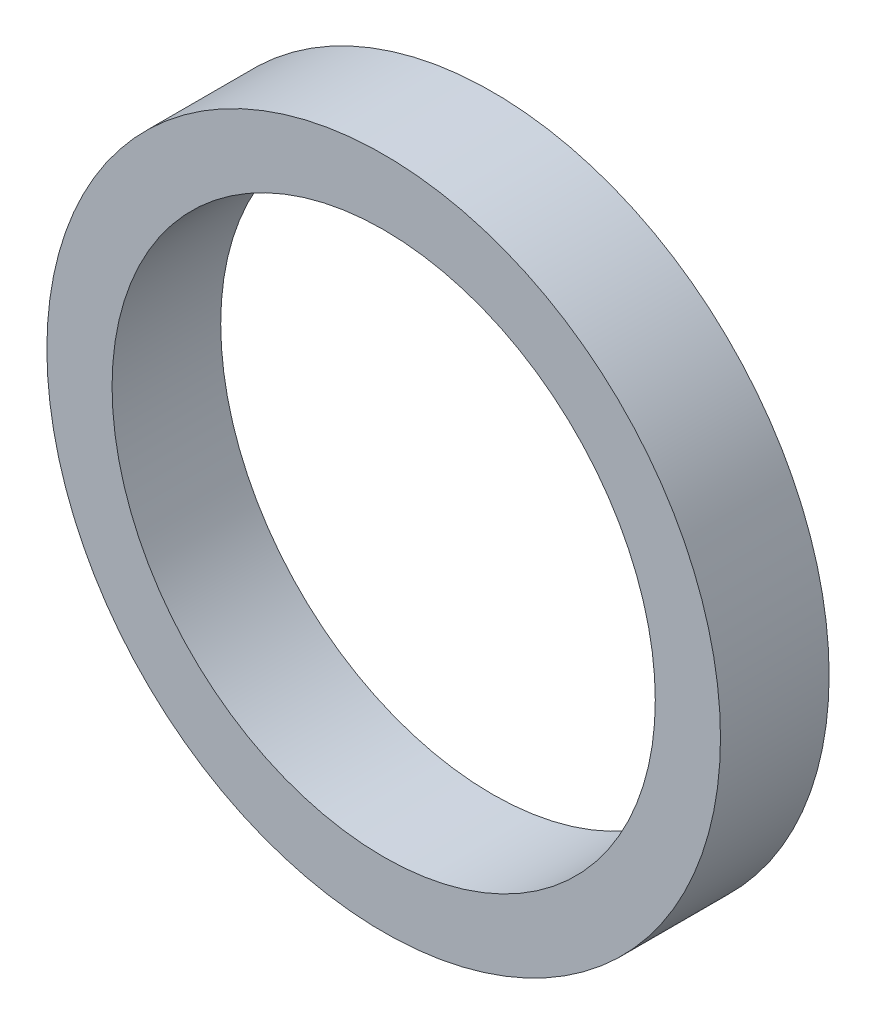
ISO-10303-21;
HEADER;
FILE_DESCRIPTION(('STEP AP214'),'2;1');
FILE_NAME('part.step','',(''),(''),'','','');
FILE_SCHEMA(('AUTOMOTIVE_DESIGN { 1 0 10303 214 1 1 1 1 }'));
ENDSEC;
DATA;
#1=APPLICATION_CONTEXT('core data for automotive mechanical design processes');
#2=APPLICATION_PROTOCOL_DEFINITION('international standard','automotive_design',2000,#1);
#3=PRODUCT_CONTEXT('',#1,'mechanical');
#4=PRODUCT('Part','Part','',(#3));
#5=PRODUCT_RELATED_PRODUCT_CATEGORY('part','',(#4));
#6=PRODUCT_DEFINITION_FORMATION('','',#4);
#7=PRODUCT_DEFINITION_CONTEXT('part definition',#1,'design');
#8=PRODUCT_DEFINITION('design','',#6,#7);
#9=PRODUCT_DEFINITION_SHAPE('','',#8);
#10=(LENGTH_UNIT() NAMED_UNIT(*) SI_UNIT(.MILLI.,.METRE.));
#11=(NAMED_UNIT(*) PLANE_ANGLE_UNIT() SI_UNIT($,.RADIAN.));
#12=(NAMED_UNIT(*) SI_UNIT($,.STERADIAN.) SOLID_ANGLE_UNIT());
#13=UNCERTAINTY_MEASURE_WITH_UNIT(LENGTH_MEASURE(1.E-05),#10,'distance_accuracy_value','');
#14=(GEOMETRIC_REPRESENTATION_CONTEXT(3) GLOBAL_UNCERTAINTY_ASSIGNED_CONTEXT((#13)) GLOBAL_UNIT_ASSIGNED_CONTEXT((#10,
#11,#12)) REPRESENTATION_CONTEXT('',''));
#15=CARTESIAN_POINT('',(0.,0.,0.));
#16=DIRECTION('',(0.,0.,1.));
#17=DIRECTION('',(1.,0.,0.));
#18=AXIS2_PLACEMENT_3D('',#15,#16,#17);
#19=CARTESIAN_POINT('',(0.,0.,5.));
#20=DIRECTION('',(0.,0.,1.));
#21=DIRECTION('',(1.,0.,0.));
#22=AXIS2_PLACEMENT_3D('',#19,#20,#21);
#23=PLANE('',#22);
#24=CARTESIAN_POINT('',(0.,0.,5.));
#25=DIRECTION('',(0.,0.,1.));
#26=DIRECTION('',(1.,0.,0.));
#27=AXIS2_PLACEMENT_3D('',#24,#25,#26);
#28=CIRCLE('',#27,15.5);
#29=CARTESIAN_POINT('',(15.5,0.,5.));
#30=VERTEX_POINT('',#29);
#31=EDGE_CURVE('E10',#30,#30,#28,.T.);
#32=ORIENTED_EDGE('',*,*,#31,.T.);
#33=EDGE_LOOP('',(#32));
#34=FACE_BOUND('',#33,.T.);
#35=CARTESIAN_POINT('',(0.,0.,5.));
#36=DIRECTION('',(0.,0.,1.));
#37=DIRECTION('',(1.,0.,0.));
#38=AXIS2_PLACEMENT_3D('',#35,#36,#37);
#39=CIRCLE('',#38,12.5);
#40=CARTESIAN_POINT('',(12.5,0.,5.));
#41=VERTEX_POINT('',#40);
#42=EDGE_CURVE('E41',#41,#41,#39,.T.);
#43=ORIENTED_EDGE('',*,*,#42,.F.);
#44=EDGE_LOOP('',(#43));
#45=FACE_BOUND('',#44,.T.);
#46=ADVANCED_FACE('F30',(#34,#45),#23,.T.);
#47=CARTESIAN_POINT('',(0.,0.,0.));
#48=DIRECTION('',(0.,0.,1.));
#49=DIRECTION('',(1.,0.,0.));
#50=AXIS2_PLACEMENT_3D('',#47,#48,#49);
#51=PLANE('',#50);
#52=CARTESIAN_POINT('',(0.,0.,0.));
#53=DIRECTION('',(0.,0.,1.));
#54=DIRECTION('',(1.,0.,0.));
#55=AXIS2_PLACEMENT_3D('',#52,#53,#54);
#56=CIRCLE('',#55,15.5);
#57=CARTESIAN_POINT('',(15.5,0.,0.));
#58=VERTEX_POINT('',#57);
#59=EDGE_CURVE('E34',#58,#58,#56,.T.);
#60=ORIENTED_EDGE('',*,*,#59,.F.);
#61=EDGE_LOOP('',(#60));
#62=FACE_BOUND('',#61,.T.);
#63=CARTESIAN_POINT('',(0.,0.,0.));
#64=DIRECTION('',(0.,0.,1.));
#65=DIRECTION('',(1.,0.,0.));
#66=AXIS2_PLACEMENT_3D('',#63,#64,#65);
#67=CIRCLE('',#66,12.5);
#68=CARTESIAN_POINT('',(12.5,0.,0.));
#69=VERTEX_POINT('',#68);
#70=EDGE_CURVE('E43',#69,#69,#67,.T.);
#71=ORIENTED_EDGE('',*,*,#70,.T.);
#72=EDGE_LOOP('',(#71));
#73=FACE_BOUND('',#72,.T.);
#74=ADVANCED_FACE('F53',(#62,#73),#51,.F.);
#75=CARTESIAN_POINT('',(0.,0.,5.));
#76=DIRECTION('',(0.,0.,-1.));
#77=DIRECTION('',(-1.,0.,0.));
#78=AXIS2_PLACEMENT_3D('',#75,#76,#77);
#79=CYLINDRICAL_SURFACE('',#78,15.5);
#80=ORIENTED_EDGE('',*,*,#31,.F.);
#81=EDGE_LOOP('',(#80));
#82=FACE_BOUND('',#81,.T.);
#83=ORIENTED_EDGE('',*,*,#59,.T.);
#84=EDGE_LOOP('',(#83));
#85=FACE_BOUND('',#84,.T.);
#86=ADVANCED_FACE('F32',(#82,#85),#79,.T.);
#87=CARTESIAN_POINT('',(0.,0.,5.));
#88=DIRECTION('',(0.,0.,-1.));
#89=DIRECTION('',(-1.,0.,0.));
#90=AXIS2_PLACEMENT_3D('',#87,#88,#89);
#91=CYLINDRICAL_SURFACE('',#90,12.5);
#92=ORIENTED_EDGE('',*,*,#42,.T.);
#93=EDGE_LOOP('',(#92));
#94=FACE_BOUND('',#93,.T.);
#95=ORIENTED_EDGE('',*,*,#70,.F.);
#96=EDGE_LOOP('',(#95));
#97=FACE_BOUND('',#96,.T.);
#98=ADVANCED_FACE('F49',(#94,#97),#91,.F.);
#99=CLOSED_SHELL('',(#46,#74,#86,#98));
#100=MANIFOLD_SOLID_BREP('B2',#99);
#101=ADVANCED_BREP_SHAPE_REPRESENTATION('',(#18,#100),#14);
#102=SHAPE_DEFINITION_REPRESENTATION(#9,#101);
ENDSEC;
END-ISO-10303-21;
